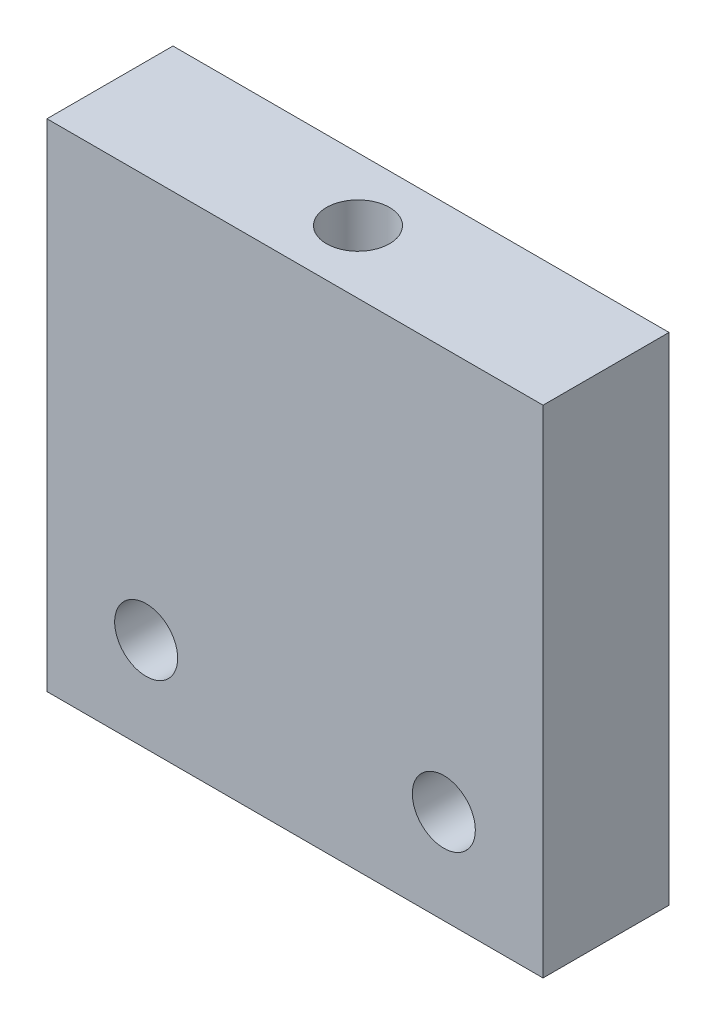
ISO-10303-21;
HEADER;
FILE_DESCRIPTION(('STEP AP214'),'2;1');
FILE_NAME('part.step','',(''),(''),'','','');
FILE_SCHEMA(('AUTOMOTIVE_DESIGN { 1 0 10303 214 1 1 1 1 }'));
ENDSEC;
DATA;
#1=APPLICATION_CONTEXT('core data for automotive mechanical design processes');
#2=APPLICATION_PROTOCOL_DEFINITION('international standard','automotive_design',2000,#1);
#3=PRODUCT_CONTEXT('',#1,'mechanical');
#4=PRODUCT('Part','Part','',(#3));
#5=PRODUCT_RELATED_PRODUCT_CATEGORY('part','',(#4));
#6=PRODUCT_DEFINITION_FORMATION('','',#4);
#7=PRODUCT_DEFINITION_CONTEXT('part definition',#1,'design');
#8=PRODUCT_DEFINITION('design','',#6,#7);
#9=PRODUCT_DEFINITION_SHAPE('','',#8);
#10=(LENGTH_UNIT() NAMED_UNIT(*) SI_UNIT(.MILLI.,.METRE.));
#11=(NAMED_UNIT(*) PLANE_ANGLE_UNIT() SI_UNIT($,.RADIAN.));
#12=(NAMED_UNIT(*) SI_UNIT($,.STERADIAN.) SOLID_ANGLE_UNIT());
#13=UNCERTAINTY_MEASURE_WITH_UNIT(LENGTH_MEASURE(1.E-05),#10,'distance_accuracy_value','');
#14=(GEOMETRIC_REPRESENTATION_CONTEXT(3) GLOBAL_UNCERTAINTY_ASSIGNED_CONTEXT((#13)) GLOBAL_UNIT_ASSIGNED_CONTEXT((#10,
#11,#12)) REPRESENTATION_CONTEXT('',''));
#15=CARTESIAN_POINT('',(0.,0.,0.));
#16=DIRECTION('',(0.,0.,1.));
#17=DIRECTION('',(1.,0.,0.));
#18=AXIS2_PLACEMENT_3D('',#15,#16,#17);
#19=CARTESIAN_POINT('',(-41.4145387762233,50.,0.));
#20=DIRECTION('',(0.,0.,1.));
#21=DIRECTION('',(1.,0.,0.));
#22=AXIS2_PLACEMENT_3D('',#19,#20,#21);
#23=PLANE('',#22);
#24=DIRECTION('',(-1.,0.,0.));
#25=VECTOR('',#24,1.);
#26=CARTESIAN_POINT('',(-41.4145387762233,0.,0.));
#27=LINE('',#26,#25);
#28=CARTESIAN_POINT('',(8.58546122377675,0.,0.));
#29=VERTEX_POINT('',#28);
#30=CARTESIAN_POINT('',(-41.4145387762233,0.,0.));
#31=VERTEX_POINT('',#30);
#32=EDGE_CURVE('E147',#29,#31,#27,.T.);
#33=ORIENTED_EDGE('',*,*,#32,.T.);
#34=DIRECTION('',(0.,-1.,0.));
#35=VECTOR('',#34,1.);
#36=CARTESIAN_POINT('',(-41.4145387762233,50.,0.));
#37=LINE('',#36,#35);
#38=CARTESIAN_POINT('',(-41.4145387762233,50.,0.));
#39=VERTEX_POINT('',#38);
#40=EDGE_CURVE('E153',#39,#31,#37,.T.);
#41=ORIENTED_EDGE('',*,*,#40,.F.);
#42=DIRECTION('',(-1.,0.,0.));
#43=VECTOR('',#42,1.);
#44=CARTESIAN_POINT('',(-41.4145387762233,50.,0.));
#45=LINE('',#44,#43);
#46=CARTESIAN_POINT('',(8.58546122377675,50.,0.));
#47=VERTEX_POINT('',#46);
#48=EDGE_CURVE('E151',#47,#39,#45,.T.);
#49=ORIENTED_EDGE('',*,*,#48,.F.);
#50=DIRECTION('',(0.,-1.,0.));
#51=VECTOR('',#50,1.);
#52=CARTESIAN_POINT('',(8.58546122377675,50.,0.));
#53=LINE('',#52,#51);
#54=EDGE_CURVE('E163',#47,#29,#53,.T.);
#55=ORIENTED_EDGE('',*,*,#54,.T.);
#56=EDGE_LOOP('',(#33,#41,#49,#55));
#57=FACE_BOUND('',#56,.T.);
#58=CARTESIAN_POINT('',(-1.41453877622325,9.5,0.));
#59=DIRECTION('',(0.,0.,1.));
#60=DIRECTION('',(1.,0.,0.));
#61=AXIS2_PLACEMENT_3D('',#58,#59,#60);
#62=CIRCLE('',#61,3.175);
#63=CARTESIAN_POINT('',(1.76046122377675,9.5,0.));
#64=VERTEX_POINT('',#63);
#65=EDGE_CURVE('E137',#64,#64,#62,.T.);
#66=ORIENTED_EDGE('',*,*,#65,.T.);
#67=EDGE_LOOP('',(#66));
#68=FACE_BOUND('',#67,.T.);
#69=CARTESIAN_POINT('',(-31.4145387762232,9.5,0.));
#70=DIRECTION('',(0.,0.,1.));
#71=DIRECTION('',(1.,0.,0.));
#72=AXIS2_PLACEMENT_3D('',#69,#70,#71);
#73=CIRCLE('',#72,3.175);
#74=CARTESIAN_POINT('',(-28.2395387762232,9.5,0.));
#75=VERTEX_POINT('',#74);
#76=EDGE_CURVE('E131',#75,#75,#73,.T.);
#77=ORIENTED_EDGE('',*,*,#76,.T.);
#78=EDGE_LOOP('',(#77));
#79=FACE_BOUND('',#78,.T.);
#80=DIRECTION('',(0.,-1.,0.));
#81=VECTOR('',#80,1.);
#82=CARTESIAN_POINT('',(-13.9145387762232,20.,0.));
#83=LINE('',#82,#81);
#84=CARTESIAN_POINT('',(-13.9145387762232,30.,0.));
#85=VERTEX_POINT('',#84);
#86=CARTESIAN_POINT('',(-13.9145387762232,20.,0.));
#87=VERTEX_POINT('',#86);
#88=EDGE_CURVE('E118',#85,#87,#83,.T.);
#89=ORIENTED_EDGE('',*,*,#88,.F.);
#90=DIRECTION('',(1.,0.,0.));
#91=VECTOR('',#90,1.);
#92=CARTESIAN_POINT('',(-18.9145387762232,30.,0.));
#93=LINE('',#92,#91);
#94=CARTESIAN_POINT('',(-18.9145387762232,30.,0.));
#95=VERTEX_POINT('',#94);
#96=EDGE_CURVE('E115',#95,#85,#93,.T.);
#97=ORIENTED_EDGE('',*,*,#96,.F.);
#98=DIRECTION('',(0.,1.,0.));
#99=VECTOR('',#98,1.);
#100=CARTESIAN_POINT('',(-18.9145387762232,20.,0.));
#101=LINE('',#100,#99);
#102=CARTESIAN_POINT('',(-18.9145387762232,20.,0.));
#103=VERTEX_POINT('',#102);
#104=EDGE_CURVE('E53',#103,#95,#101,.T.);
#105=ORIENTED_EDGE('',*,*,#104,.F.);
#106=DIRECTION('',(-1.,0.,0.));
#107=VECTOR('',#106,1.);
#108=CARTESIAN_POINT('',(-18.9145387762232,20.,0.));
#109=LINE('',#108,#107);
#110=EDGE_CURVE('E48',#87,#103,#109,.T.);
#111=ORIENTED_EDGE('',*,*,#110,.F.);
#112=EDGE_LOOP('',(#89,#97,#105,#111));
#113=FACE_BOUND('',#112,.T.);
#114=ADVANCED_FACE('F33',(#57,#68,#79,#113),#23,.F.);
#115=CARTESIAN_POINT('',(-41.4145387762233,50.,0.));
#116=DIRECTION('',(1.,0.,0.));
#117=DIRECTION('',(0.,0.,-1.));
#118=AXIS2_PLACEMENT_3D('',#115,#116,#117);
#119=PLANE('',#118);
#120=DIRECTION('',(0.,0.,1.));
#121=VECTOR('',#120,1.);
#122=CARTESIAN_POINT('',(-41.4145387762233,0.,0.));
#123=LINE('',#122,#121);
#124=CARTESIAN_POINT('',(-41.4145387762233,0.,12.7));
#125=VERTEX_POINT('',#124);
#126=EDGE_CURVE('E140',#31,#125,#123,.T.);
#127=ORIENTED_EDGE('',*,*,#126,.T.);
#128=DIRECTION('',(0.,-1.,0.));
#129=VECTOR('',#128,1.);
#130=CARTESIAN_POINT('',(-41.4145387762233,50.,12.7));
#131=LINE('',#130,#129);
#132=CARTESIAN_POINT('',(-41.4145387762233,50.,12.7));
#133=VERTEX_POINT('',#132);
#134=EDGE_CURVE('E11',#133,#125,#131,.T.);
#135=ORIENTED_EDGE('',*,*,#134,.F.);
#136=DIRECTION('',(0.,0.,1.));
#137=VECTOR('',#136,1.);
#138=CARTESIAN_POINT('',(-41.4145387762233,50.,0.));
#139=LINE('',#138,#137);
#140=EDGE_CURVE('E143',#39,#133,#139,.T.);
#141=ORIENTED_EDGE('',*,*,#140,.F.);
#142=ORIENTED_EDGE('',*,*,#40,.T.);
#143=EDGE_LOOP('',(#127,#135,#141,#142));
#144=FACE_BOUND('',#143,.T.);
#145=ADVANCED_FACE('F35',(#144),#119,.F.);
#146=CARTESIAN_POINT('',(-41.4145387762233,50.,12.7));
#147=DIRECTION('',(0.,0.,-1.));
#148=DIRECTION('',(-1.,0.,0.));
#149=AXIS2_PLACEMENT_3D('',#146,#147,#148);
#150=PLANE('',#149);
#151=CARTESIAN_POINT('',(-31.4145387762232,9.5,12.7));
#152=DIRECTION('',(0.,0.,1.));
#153=DIRECTION('',(1.,0.,0.));
#154=AXIS2_PLACEMENT_3D('',#151,#152,#153);
#155=CIRCLE('',#154,3.175);
#156=CARTESIAN_POINT('',(-28.2395387762232,9.5,12.7));
#157=VERTEX_POINT('',#156);
#158=EDGE_CURVE('E129',#157,#157,#155,.T.);
#159=ORIENTED_EDGE('',*,*,#158,.F.);
#160=EDGE_LOOP('',(#159));
#161=FACE_BOUND('',#160,.T.);
#162=CARTESIAN_POINT('',(-1.41453877622325,9.5,12.7));
#163=DIRECTION('',(0.,0.,1.));
#164=DIRECTION('',(1.,0.,0.));
#165=AXIS2_PLACEMENT_3D('',#162,#163,#164);
#166=CIRCLE('',#165,3.175);
#167=CARTESIAN_POINT('',(1.76046122377675,9.5,12.7));
#168=VERTEX_POINT('',#167);
#169=EDGE_CURVE('E134',#168,#168,#166,.T.);
#170=ORIENTED_EDGE('',*,*,#169,.F.);
#171=EDGE_LOOP('',(#170));
#172=FACE_BOUND('',#171,.T.);
#173=DIRECTION('',(1.,0.,0.));
#174=VECTOR('',#173,1.);
#175=CARTESIAN_POINT('',(-41.4145387762233,0.,12.7));
#176=LINE('',#175,#174);
#177=CARTESIAN_POINT('',(8.58546122377675,0.,12.7));
#178=VERTEX_POINT('',#177);
#179=EDGE_CURVE('E156',#125,#178,#176,.T.);
#180=ORIENTED_EDGE('',*,*,#179,.T.);
#181=DIRECTION('',(0.,-1.,0.));
#182=VECTOR('',#181,1.);
#183=CARTESIAN_POINT('',(8.58546122377675,50.,12.7));
#184=LINE('',#183,#182);
#185=CARTESIAN_POINT('',(8.58546122377675,50.,12.7));
#186=VERTEX_POINT('',#185);
#187=EDGE_CURVE('E41',#186,#178,#184,.T.);
#188=ORIENTED_EDGE('',*,*,#187,.F.);
#189=DIRECTION('',(1.,0.,0.));
#190=VECTOR('',#189,1.);
#191=CARTESIAN_POINT('',(-41.4145387762233,50.,12.7));
#192=LINE('',#191,#190);
#193=EDGE_CURVE('E146',#133,#186,#192,.T.);
#194=ORIENTED_EDGE('',*,*,#193,.F.);
#195=ORIENTED_EDGE('',*,*,#134,.T.);
#196=EDGE_LOOP('',(#180,#188,#194,#195));
#197=FACE_BOUND('',#196,.T.);
#198=ADVANCED_FACE('F186',(#161,#172,#197),#150,.F.);
#199=CARTESIAN_POINT('',(8.58546122377675,50.,0.));
#200=DIRECTION('',(-1.,0.,0.));
#201=DIRECTION('',(0.,0.,1.));
#202=AXIS2_PLACEMENT_3D('',#199,#200,#201);
#203=PLANE('',#202);
#204=DIRECTION('',(0.,0.,-1.));
#205=VECTOR('',#204,1.);
#206=CARTESIAN_POINT('',(8.58546122377675,0.,0.));
#207=LINE('',#206,#205);
#208=EDGE_CURVE('E158',#178,#29,#207,.T.);
#209=ORIENTED_EDGE('',*,*,#208,.T.);
#210=ORIENTED_EDGE('',*,*,#54,.F.);
#211=DIRECTION('',(0.,0.,-1.));
#212=VECTOR('',#211,1.);
#213=CARTESIAN_POINT('',(8.58546122377675,50.,0.));
#214=LINE('',#213,#212);
#215=EDGE_CURVE('E149',#186,#47,#214,.T.);
#216=ORIENTED_EDGE('',*,*,#215,.F.);
#217=ORIENTED_EDGE('',*,*,#187,.T.);
#218=EDGE_LOOP('',(#209,#210,#216,#217));
#219=FACE_BOUND('',#218,.T.);
#220=ADVANCED_FACE('F170',(#219),#203,.F.);
#221=CARTESIAN_POINT('',(0.,50.,0.));
#222=DIRECTION('',(0.,1.,0.));
#223=DIRECTION('',(0.,0.,1.));
#224=AXIS2_PLACEMENT_3D('',#221,#222,#223);
#225=PLANE('',#224);
#226=CARTESIAN_POINT('',(-16.4145387762233,50.,6.35));
#227=DIRECTION('',(0.,1.,0.));
#228=DIRECTION('',(0.,0.,1.));
#229=AXIS2_PLACEMENT_3D('',#226,#227,#228);
#230=CIRCLE('',#229,3.175);
#231=CARTESIAN_POINT('',(-16.4145387762233,50.,9.525));
#232=VERTEX_POINT('',#231);
#233=EDGE_CURVE('E119',#232,#232,#230,.T.);
#234=ORIENTED_EDGE('',*,*,#233,.F.);
#235=EDGE_LOOP('',(#234));
#236=FACE_BOUND('',#235,.T.);
#237=ORIENTED_EDGE('',*,*,#140,.T.);
#238=ORIENTED_EDGE('',*,*,#193,.T.);
#239=ORIENTED_EDGE('',*,*,#215,.T.);
#240=ORIENTED_EDGE('',*,*,#48,.T.);
#241=EDGE_LOOP('',(#237,#238,#239,#240));
#242=FACE_BOUND('',#241,.T.);
#243=ADVANCED_FACE('F185',(#236,#242),#225,.T.);
#244=CARTESIAN_POINT('',(0.,0.,0.));
#245=DIRECTION('',(0.,1.,0.));
#246=DIRECTION('',(0.,0.,1.));
#247=AXIS2_PLACEMENT_3D('',#244,#245,#246);
#248=PLANE('',#247);
#249=ORIENTED_EDGE('',*,*,#126,.F.);
#250=ORIENTED_EDGE('',*,*,#32,.F.);
#251=ORIENTED_EDGE('',*,*,#208,.F.);
#252=ORIENTED_EDGE('',*,*,#179,.F.);
#253=EDGE_LOOP('',(#249,#250,#251,#252));
#254=FACE_BOUND('',#253,.T.);
#255=ADVANCED_FACE('F176',(#254),#248,.F.);
#256=CARTESIAN_POINT('',(-1.41453877622325,9.5,0.));
#257=DIRECTION('',(0.,0.,1.));
#258=DIRECTION('',(1.,0.,0.));
#259=AXIS2_PLACEMENT_3D('',#256,#257,#258);
#260=CYLINDRICAL_SURFACE('',#259,3.175);
#261=ORIENTED_EDGE('',*,*,#65,.F.);
#262=EDGE_LOOP('',(#261));
#263=FACE_BOUND('',#262,.T.);
#264=ORIENTED_EDGE('',*,*,#169,.T.);
#265=EDGE_LOOP('',(#264));
#266=FACE_BOUND('',#265,.T.);
#267=ADVANCED_FACE('F203',(#263,#266),#260,.F.);
#268=CARTESIAN_POINT('',(-31.4145387762232,9.5,0.));
#269=DIRECTION('',(0.,0.,1.));
#270=DIRECTION('',(1.,0.,0.));
#271=AXIS2_PLACEMENT_3D('',#268,#269,#270);
#272=CYLINDRICAL_SURFACE('',#271,3.175);
#273=ORIENTED_EDGE('',*,*,#76,.F.);
#274=EDGE_LOOP('',(#273));
#275=FACE_BOUND('',#274,.T.);
#276=ORIENTED_EDGE('',*,*,#158,.T.);
#277=EDGE_LOOP('',(#276));
#278=FACE_BOUND('',#277,.T.);
#279=ADVANCED_FACE('F209',(#275,#278),#272,.F.);
#280=CARTESIAN_POINT('',(-16.4145387762233,20.,6.35));
#281=DIRECTION('',(0.,1.,0.));
#282=DIRECTION('',(0.,0.,1.));
#283=AXIS2_PLACEMENT_3D('',#280,#281,#282);
#284=CYLINDRICAL_SURFACE('',#283,3.175);
#285=CARTESIAN_POINT('',(-16.4145387762233,20.,6.35));
#286=DIRECTION('',(0.,1.,0.));
#287=DIRECTION('',(0.,0.,1.));
#288=AXIS2_PLACEMENT_3D('',#285,#286,#287);
#289=CIRCLE('',#288,3.175);
#290=CARTESIAN_POINT('',(-16.4145387762233,20.,9.525));
#291=VERTEX_POINT('',#290);
#292=EDGE_CURVE('E122',#291,#291,#289,.T.);
#293=ORIENTED_EDGE('',*,*,#292,.F.);
#294=EDGE_LOOP('',(#293));
#295=FACE_BOUND('',#294,.T.);
#296=ORIENTED_EDGE('',*,*,#233,.T.);
#297=EDGE_LOOP('',(#296));
#298=FACE_BOUND('',#297,.T.);
#299=ADVANCED_FACE('F213',(#295,#298),#284,.F.);
#300=CARTESIAN_POINT('',(-16.4145387762233,20.,6.35));
#301=DIRECTION('',(0.,1.,0.));
#302=DIRECTION('',(0.,0.,1.));
#303=AXIS2_PLACEMENT_3D('',#300,#301,#302);
#304=PLANE('',#303);
#305=ORIENTED_EDGE('',*,*,#292,.T.);
#306=EDGE_LOOP('',(#305));
#307=FACE_BOUND('',#306,.T.);
#308=ADVANCED_FACE('F217',(#307),#304,.T.);
#309=CARTESIAN_POINT('',(-13.9145387762232,20.,-5.));
#310=DIRECTION('',(-1.,0.,0.));
#311=DIRECTION('',(0.,0.,1.));
#312=AXIS2_PLACEMENT_3D('',#309,#310,#311);
#313=PLANE('',#312);
#314=ORIENTED_EDGE('',*,*,#88,.T.);
#315=DIRECTION('',(0.,0.,1.));
#316=VECTOR('',#315,1.);
#317=CARTESIAN_POINT('',(-13.9145387762232,20.,-5.));
#318=LINE('',#317,#316);
#319=CARTESIAN_POINT('',(-13.9145387762232,20.,-5.));
#320=VERTEX_POINT('',#319);
#321=EDGE_CURVE('E99',#320,#87,#318,.T.);
#322=ORIENTED_EDGE('',*,*,#321,.F.);
#323=DIRECTION('',(0.,-1.,0.));
#324=VECTOR('',#323,1.);
#325=CARTESIAN_POINT('',(-13.9145387762232,20.,-5.));
#326=LINE('',#325,#324);
#327=CARTESIAN_POINT('',(-13.9145387762232,30.,-5.));
#328=VERTEX_POINT('',#327);
#329=EDGE_CURVE('E106',#328,#320,#326,.T.);
#330=ORIENTED_EDGE('',*,*,#329,.F.);
#331=DIRECTION('',(0.,0.,1.));
#332=VECTOR('',#331,1.);
#333=CARTESIAN_POINT('',(-13.9145387762232,30.,-5.));
#334=LINE('',#333,#332);
#335=EDGE_CURVE('E323',#328,#85,#334,.T.);
#336=ORIENTED_EDGE('',*,*,#335,.T.);
#337=EDGE_LOOP('',(#314,#322,#330,#336));
#338=FACE_BOUND('',#337,.T.);
#339=ADVANCED_FACE('F117',(#338),#313,.F.);
#340=CARTESIAN_POINT('',(-18.9145387762232,20.,-5.));
#341=DIRECTION('',(0.,1.,0.));
#342=DIRECTION('',(0.,0.,1.));
#343=AXIS2_PLACEMENT_3D('',#340,#341,#342);
#344=PLANE('',#343);
#345=ORIENTED_EDGE('',*,*,#110,.T.);
#346=DIRECTION('',(0.,0.,1.));
#347=VECTOR('',#346,1.);
#348=CARTESIAN_POINT('',(-18.9145387762232,20.,-5.));
#349=LINE('',#348,#347);
#350=CARTESIAN_POINT('',(-18.9145387762232,20.,-5.));
#351=VERTEX_POINT('',#350);
#352=EDGE_CURVE('E102',#351,#103,#349,.T.);
#353=ORIENTED_EDGE('',*,*,#352,.F.);
#354=DIRECTION('',(-1.,0.,0.));
#355=VECTOR('',#354,1.);
#356=CARTESIAN_POINT('',(-18.9145387762232,20.,-5.));
#357=LINE('',#356,#355);
#358=EDGE_CURVE('E95',#320,#351,#357,.T.);
#359=ORIENTED_EDGE('',*,*,#358,.F.);
#360=ORIENTED_EDGE('',*,*,#321,.T.);
#361=EDGE_LOOP('',(#345,#353,#359,#360));
#362=FACE_BOUND('',#361,.T.);
#363=ADVANCED_FACE('F97',(#362),#344,.F.);
#364=CARTESIAN_POINT('',(-18.9145387762232,20.,-5.));
#365=DIRECTION('',(1.,0.,0.));
#366=DIRECTION('',(0.,0.,-1.));
#367=AXIS2_PLACEMENT_3D('',#364,#365,#366);
#368=PLANE('',#367);
#369=ORIENTED_EDGE('',*,*,#104,.T.);
#370=DIRECTION('',(0.,0.,1.));
#371=VECTOR('',#370,1.);
#372=CARTESIAN_POINT('',(-18.9145387762232,30.,-5.));
#373=LINE('',#372,#371);
#374=CARTESIAN_POINT('',(-18.9145387762232,30.,-5.));
#375=VERTEX_POINT('',#374);
#376=EDGE_CURVE('E124',#375,#95,#373,.T.);
#377=ORIENTED_EDGE('',*,*,#376,.F.);
#378=DIRECTION('',(0.,1.,0.));
#379=VECTOR('',#378,1.);
#380=CARTESIAN_POINT('',(-18.9145387762232,20.,-5.));
#381=LINE('',#380,#379);
#382=EDGE_CURVE('E105',#351,#375,#381,.T.);
#383=ORIENTED_EDGE('',*,*,#382,.F.);
#384=ORIENTED_EDGE('',*,*,#352,.T.);
#385=EDGE_LOOP('',(#369,#377,#383,#384));
#386=FACE_BOUND('',#385,.T.);
#387=ADVANCED_FACE('F226',(#386),#368,.F.);
#388=CARTESIAN_POINT('',(-18.9145387762232,30.,-5.));
#389=DIRECTION('',(0.,-1.,0.));
#390=DIRECTION('',(0.,0.,-1.));
#391=AXIS2_PLACEMENT_3D('',#388,#389,#390);
#392=PLANE('',#391);
#393=ORIENTED_EDGE('',*,*,#96,.T.);
#394=ORIENTED_EDGE('',*,*,#335,.F.);
#395=DIRECTION('',(1.,0.,0.));
#396=VECTOR('',#395,1.);
#397=CARTESIAN_POINT('',(-18.9145387762232,30.,-5.));
#398=LINE('',#397,#396);
#399=EDGE_CURVE('E111',#375,#328,#398,.T.);
#400=ORIENTED_EDGE('',*,*,#399,.F.);
#401=ORIENTED_EDGE('',*,*,#376,.T.);
#402=EDGE_LOOP('',(#393,#394,#400,#401));
#403=FACE_BOUND('',#402,.T.);
#404=ADVANCED_FACE('F229',(#403),#392,.F.);
#405=CARTESIAN_POINT('',(0.,0.,-5.));
#406=DIRECTION('',(0.,0.,-1.));
#407=DIRECTION('',(-1.,0.,0.));
#408=AXIS2_PLACEMENT_3D('',#405,#406,#407);
#409=PLANE('',#408);
#410=ORIENTED_EDGE('',*,*,#329,.T.);
#411=ORIENTED_EDGE('',*,*,#358,.T.);
#412=ORIENTED_EDGE('',*,*,#382,.T.);
#413=ORIENTED_EDGE('',*,*,#399,.T.);
#414=EDGE_LOOP('',(#410,#411,#412,#413));
#415=FACE_BOUND('',#414,.T.);
#416=ADVANCED_FACE('F109',(#415),#409,.T.);
#417=CLOSED_SHELL('',(#114,#145,#198,#220,#243,#255,#267,#279,#299,#308,#339,#363,#387,#404,#416));
#418=MANIFOLD_SOLID_BREP('B2',#417);
#419=ADVANCED_BREP_SHAPE_REPRESENTATION('',(#18,#418),#14);
#420=SHAPE_DEFINITION_REPRESENTATION(#9,#419);
ENDSEC;
END-ISO-10303-21;
